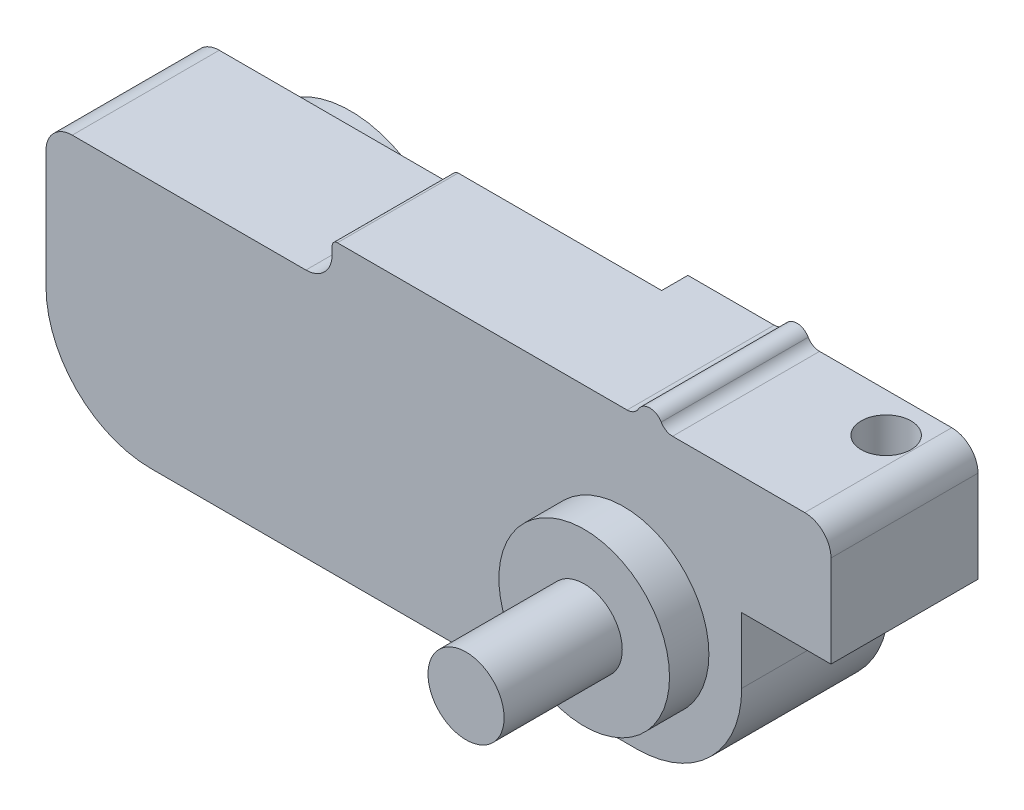
ISO-10303-21;
HEADER;
FILE_DESCRIPTION(('STEP AP214'),'2;1');
FILE_NAME('part.step','',(''),(''),'','','');
FILE_SCHEMA(('AUTOMOTIVE_DESIGN { 1 0 10303 214 1 1 1 1 }'));
ENDSEC;
DATA;
#1=APPLICATION_CONTEXT('core data for automotive mechanical design processes');
#2=APPLICATION_PROTOCOL_DEFINITION('international standard','automotive_design',2000,#1);
#3=PRODUCT_CONTEXT('',#1,'mechanical');
#4=PRODUCT('Part','Part','',(#3));
#5=PRODUCT_RELATED_PRODUCT_CATEGORY('part','',(#4));
#6=PRODUCT_DEFINITION_FORMATION('','',#4);
#7=PRODUCT_DEFINITION_CONTEXT('part definition',#1,'design');
#8=PRODUCT_DEFINITION('design','',#6,#7);
#9=PRODUCT_DEFINITION_SHAPE('','',#8);
#10=(LENGTH_UNIT() NAMED_UNIT(*) SI_UNIT(.MILLI.,.METRE.));
#11=(NAMED_UNIT(*) PLANE_ANGLE_UNIT() SI_UNIT($,.RADIAN.));
#12=(NAMED_UNIT(*) SI_UNIT($,.STERADIAN.) SOLID_ANGLE_UNIT());
#13=UNCERTAINTY_MEASURE_WITH_UNIT(LENGTH_MEASURE(1.E-05),#10,'distance_accuracy_value','');
#14=(GEOMETRIC_REPRESENTATION_CONTEXT(3) GLOBAL_UNCERTAINTY_ASSIGNED_CONTEXT((#13)) GLOBAL_UNIT_ASSIGNED_CONTEXT((#10,
#11,#12)) REPRESENTATION_CONTEXT('',''));
#15=CARTESIAN_POINT('',(0.,0.,0.));
#16=DIRECTION('',(0.,0.,1.));
#17=DIRECTION('',(1.,0.,0.));
#18=AXIS2_PLACEMENT_3D('',#15,#16,#17);
#19=CARTESIAN_POINT('',(0.,0.,0.));
#20=DIRECTION('',(0.,0.,1.));
#21=DIRECTION('',(1.,0.,0.));
#22=AXIS2_PLACEMENT_3D('',#19,#20,#21);
#23=PLANE('',#22);
#24=DIRECTION('',(1.,0.,0.));
#25=VECTOR('',#24,1.);
#26=CARTESIAN_POINT('',(37.0734009118206,-1.50250659283963,0.));
#27=LINE('',#26,#25);
#28=CARTESIAN_POINT('',(37.0734009118206,-1.50250659283963,0.));
#29=VERTEX_POINT('',#28);
#30=CARTESIAN_POINT('',(37.7443595981123,-1.50250659283966,0.));
#31=VERTEX_POINT('',#30);
#32=EDGE_CURVE('E467',#29,#31,#27,.T.);
#33=ORIENTED_EDGE('',*,*,#32,.F.);
#34=CARTESIAN_POINT('',(33.0734009118206,-1.50250659283963,0.));
#35=DIRECTION('',(0.,0.,-1.));
#36=DIRECTION('',(-1.,0.,0.));
#37=AXIS2_PLACEMENT_3D('',#34,#35,#36);
#38=CIRCLE('',#37,4.);
#39=CARTESIAN_POINT('',(29.0734009118206,-1.50250659283963,0.));
#40=VERTEX_POINT('',#39);
#41=EDGE_CURVE('E251',#40,#29,#38,.T.);
#42=ORIENTED_EDGE('',*,*,#41,.F.);
#43=DIRECTION('',(0.,-1.,0.));
#44=VECTOR('',#43,1.);
#45=CARTESIAN_POINT('',(29.0734009118206,5.49749340716037,0.));
#46=LINE('',#45,#44);
#47=CARTESIAN_POINT('',(29.0734009118206,2.99749340716037,0.));
#48=VERTEX_POINT('',#47);
#49=EDGE_CURVE('E348',#48,#40,#46,.T.);
#50=ORIENTED_EDGE('',*,*,#49,.F.);
#51=CARTESIAN_POINT('',(30.0734009118206,2.99749340716037,0.));
#52=DIRECTION('',(0.,0.,1.));
#53=DIRECTION('',(1.,0.,0.));
#54=AXIS2_PLACEMENT_3D('',#51,#52,#53);
#55=CIRCLE('',#54,1.);
#56=CARTESIAN_POINT('',(30.0734009118206,3.99749340716037,0.));
#57=VERTEX_POINT('',#56);
#58=EDGE_CURVE('E413',#48,#57,#55,.F.);
#59=ORIENTED_EDGE('',*,*,#58,.T.);
#60=DIRECTION('',(1.,0.,0.));
#61=VECTOR('',#60,1.);
#62=CARTESIAN_POINT('',(29.0734009118206,3.99749340716037,0.));
#63=LINE('',#62,#61);
#64=CARTESIAN_POINT('',(38.7234009118206,3.99749340716037,0.));
#65=VERTEX_POINT('',#64);
#66=EDGE_CURVE('E286',#57,#65,#63,.T.);
#67=ORIENTED_EDGE('',*,*,#66,.T.);
#68=DIRECTION('',(0.,1.,0.));
#69=VECTOR('',#68,1.);
#70=CARTESIAN_POINT('',(38.7234009118206,5.49749340716037,0.));
#71=LINE('',#70,#69);
#72=CARTESIAN_POINT('',(38.7234009118206,1.79749340716037,0.));
#73=VERTEX_POINT('',#72);
#74=EDGE_CURVE('E265',#73,#65,#71,.T.);
#75=ORIENTED_EDGE('',*,*,#74,.F.);
#76=DIRECTION('',(-1.,0.,0.));
#77=VECTOR('',#76,1.);
#78=CARTESIAN_POINT('',(47.9234009118206,1.79749340716037,0.));
#79=LINE('',#78,#77);
#80=CARTESIAN_POINT('',(45.9234009118206,1.79749340716037,0.));
#81=VERTEX_POINT('',#80);
#82=EDGE_CURVE('E256',#81,#73,#79,.T.);
#83=ORIENTED_EDGE('',*,*,#82,.F.);
#84=CARTESIAN_POINT('',(45.9234009118206,3.79749340716037,0.));
#85=DIRECTION('',(0.,0.,1.));
#86=DIRECTION('',(1.,0.,0.));
#87=AXIS2_PLACEMENT_3D('',#84,#85,#86);
#88=CIRCLE('',#87,2.);
#89=CARTESIAN_POINT('',(47.9234009118206,3.79749340716037,0.));
#90=VERTEX_POINT('',#89);
#91=EDGE_CURVE('E442',#81,#90,#88,.T.);
#92=ORIENTED_EDGE('',*,*,#91,.T.);
#93=DIRECTION('',(0.,-1.,0.));
#94=VECTOR('',#93,1.);
#95=CARTESIAN_POINT('',(47.9234009118206,5.49749340716037,0.));
#96=LINE('',#95,#94);
#97=CARTESIAN_POINT('',(47.9234009118206,5.49749340716037,0.));
#98=VERTEX_POINT('',#97);
#99=EDGE_CURVE('E252',#98,#90,#96,.T.);
#100=ORIENTED_EDGE('',*,*,#99,.F.);
#101=DIRECTION('',(-1.,0.,0.));
#102=VECTOR('',#101,1.);
#103=CARTESIAN_POINT('',(29.0734009118206,5.49749340716037,0.));
#104=LINE('',#103,#102);
#105=CARTESIAN_POINT('',(51.2073755080361,5.49749340716037,0.));
#106=VERTEX_POINT('',#105);
#107=EDGE_CURVE('E368',#106,#98,#104,.T.);
#108=ORIENTED_EDGE('',*,*,#107,.F.);
#109=CARTESIAN_POINT('',(51.2073755080361,5.99749340716037,0.));
#110=DIRECTION('',(0.,0.,1.));
#111=DIRECTION('',(1.,0.,0.));
#112=AXIS2_PLACEMENT_3D('',#109,#110,#111);
#113=CIRCLE('',#112,0.5);
#114=CARTESIAN_POINT('',(51.6403882099283,5.74749340716036,0.));
#115=VERTEX_POINT('',#114);
#116=EDGE_CURVE('E393',#106,#115,#113,.T.);
#117=ORIENTED_EDGE('',*,*,#116,.T.);
#118=CARTESIAN_POINT('',(52.0734009118206,5.49749340716037,0.));
#119=DIRECTION('',(0.,0.,1.));
#120=DIRECTION('',(1.,0.,0.));
#121=AXIS2_PLACEMENT_3D('',#118,#119,#120);
#122=CIRCLE('',#121,0.499999999999999);
#123=CARTESIAN_POINT('',(52.5064136137128,5.74749340716036,0.));
#124=VERTEX_POINT('',#123);
#125=EDGE_CURVE('E301',#124,#115,#122,.T.);
#126=ORIENTED_EDGE('',*,*,#125,.F.);
#127=CARTESIAN_POINT('',(52.939426315605,5.99749340716037,0.));
#128=DIRECTION('',(0.,0.,1.));
#129=DIRECTION('',(1.,0.,0.));
#130=AXIS2_PLACEMENT_3D('',#127,#128,#129);
#131=CIRCLE('',#130,0.5);
#132=CARTESIAN_POINT('',(52.939426315605,5.49749340716037,0.));
#133=VERTEX_POINT('',#132);
#134=EDGE_CURVE('E390',#124,#133,#131,.T.);
#135=ORIENTED_EDGE('',*,*,#134,.T.);
#136=CARTESIAN_POINT('',(57.9734009118206,5.49749340716037,0.));
#137=VERTEX_POINT('',#136);
#138=EDGE_CURVE('E353',#137,#133,#104,.T.);
#139=ORIENTED_EDGE('',*,*,#138,.F.);
#140=CARTESIAN_POINT('',(57.9734009118206,4.49749340716037,0.));
#141=DIRECTION('',(0.,0.,1.));
#142=DIRECTION('',(1.,0.,0.));
#143=AXIS2_PLACEMENT_3D('',#140,#141,#142);
#144=CIRCLE('',#143,1.);
#145=CARTESIAN_POINT('',(58.9734009118206,4.49749340716037,0.));
#146=VERTEX_POINT('',#145);
#147=EDGE_CURVE('E400',#137,#146,#144,.F.);
#148=ORIENTED_EDGE('',*,*,#147,.T.);
#149=DIRECTION('',(0.,1.,0.));
#150=VECTOR('',#149,1.);
#151=CARTESIAN_POINT('',(58.9734009118206,5.49749340716037,0.));
#152=LINE('',#151,#150);
#153=CARTESIAN_POINT('',(58.9734009118206,0.997493407160366,0.));
#154=VERTEX_POINT('',#153);
#155=EDGE_CURVE('E365',#154,#146,#152,.T.);
#156=ORIENTED_EDGE('',*,*,#155,.F.);
#157=DIRECTION('',(-1.,0.,0.));
#158=VECTOR('',#157,1.);
#159=CARTESIAN_POINT('',(58.9734009118206,0.997493407160366,0.));
#160=LINE('',#159,#158);
#161=CARTESIAN_POINT('',(55.5734009118206,0.997493407160366,0.));
#162=VERTEX_POINT('',#161);
#163=EDGE_CURVE('E307',#154,#162,#160,.T.);
#164=ORIENTED_EDGE('',*,*,#163,.T.);
#165=DIRECTION('',(0.,-1.,0.));
#166=VECTOR('',#165,1.);
#167=CARTESIAN_POINT('',(55.5734009118206,-5.50250659283963,0.));
#168=LINE('',#167,#166);
#169=CARTESIAN_POINT('',(55.5734009118206,-1.50250659283963,0.));
#170=VERTEX_POINT('',#169);
#171=EDGE_CURVE('E310',#162,#170,#168,.T.);
#172=ORIENTED_EDGE('',*,*,#171,.T.);
#173=CARTESIAN_POINT('',(51.5734009118206,-1.50250659283963,0.));
#174=DIRECTION('',(0.,0.,1.));
#175=DIRECTION('',(1.,0.,0.));
#176=AXIS2_PLACEMENT_3D('',#173,#174,#175);
#177=CIRCLE('',#176,4.);
#178=CARTESIAN_POINT('',(51.5734009118206,-5.50250659283963,0.));
#179=VERTEX_POINT('',#178);
#180=EDGE_CURVE('E376',#170,#179,#177,.F.);
#181=ORIENTED_EDGE('',*,*,#180,.T.);
#182=DIRECTION('',(1.,0.,0.));
#183=VECTOR('',#182,1.);
#184=CARTESIAN_POINT('',(29.0734009118206,-5.50250659283963,0.));
#185=LINE('',#184,#183);
#186=CARTESIAN_POINT('',(33.0734009118206,-5.50250659283963,0.));
#187=VERTEX_POINT('',#186);
#188=EDGE_CURVE('E362',#187,#179,#185,.T.);
#189=ORIENTED_EDGE('',*,*,#188,.F.);
#190=CARTESIAN_POINT('',(36.5375025269583,-3.50250659283963,0.));
#191=VERTEX_POINT('',#190);
#192=EDGE_CURVE('E342',#191,#187,#38,.T.);
#193=ORIENTED_EDGE('',*,*,#192,.F.);
#194=DIRECTION('',(-0.967387380482816,0.253301512199584,0.));
#195=VECTOR('',#194,1.);
#196=CARTESIAN_POINT('',(38.7443595981122,-4.08035187448123,0.));
#197=LINE('',#196,#195);
#198=CARTESIAN_POINT('',(37.4910580859126,-3.75218636944464,0.));
#199=VERTEX_POINT('',#198);
#200=EDGE_CURVE('E245',#199,#191,#197,.T.);
#201=ORIENTED_EDGE('',*,*,#200,.F.);
#202=CARTESIAN_POINT('',(37.7443595981122,-2.78479898896182,0.));
#203=DIRECTION('',(0.,0.,1.));
#204=DIRECTION('',(1.,0.,0.));
#205=AXIS2_PLACEMENT_3D('',#202,#203,#204);
#206=CIRCLE('',#205,1.);
#207=CARTESIAN_POINT('',(38.7443595981122,-2.78479898896186,0.));
#208=VERTEX_POINT('',#207);
#209=EDGE_CURVE('E48',#199,#208,#206,.T.);
#210=ORIENTED_EDGE('',*,*,#209,.T.);
#211=DIRECTION('',(0.,-1.,0.));
#212=VECTOR('',#211,1.);
#213=CARTESIAN_POINT('',(38.7443595981123,-1.50250659283969,0.));
#214=LINE('',#213,#212);
#215=CARTESIAN_POINT('',(38.7443595981122,-2.50250659283969,0.));
#216=VERTEX_POINT('',#215);
#217=EDGE_CURVE('E458',#216,#208,#214,.T.);
#218=ORIENTED_EDGE('',*,*,#217,.F.);
#219=CARTESIAN_POINT('',(37.7443595981122,-2.50250659283966,0.));
#220=DIRECTION('',(0.,0.,1.));
#221=DIRECTION('',(1.,0.,0.));
#222=AXIS2_PLACEMENT_3D('',#219,#220,#221);
#223=CIRCLE('',#222,1.);
#224=EDGE_CURVE('E11',#216,#31,#223,.T.);
#225=ORIENTED_EDGE('',*,*,#224,.T.);
#226=EDGE_LOOP('',(#33,#42,#50,#59,#67,#75,#83,#92,#100,#108,#117,#126,#135,#139,#148,#156,#164,
#172,#181,#189,#193,#201,#210,#218,#225));
#227=FACE_BOUND('',#226,.T.);
#228=ADVANCED_FACE('F40',(#227),#23,.F.);
#229=CARTESIAN_POINT('',(33.0734009118206,-1.50250659283963,-2.));
#230=DIRECTION('',(0.,0.,1.));
#231=DIRECTION('',(1.,0.,0.));
#232=AXIS2_PLACEMENT_3D('',#229,#230,#231);
#233=CYLINDRICAL_SURFACE('',#232,4.);
#234=CARTESIAN_POINT('',(33.0734009118206,-1.50250659283963,-2.));
#235=DIRECTION('',(0.,0.,-1.));
#236=DIRECTION('',(-1.,0.,0.));
#237=AXIS2_PLACEMENT_3D('',#234,#235,#236);
#238=CIRCLE('',#237,4.);
#239=CARTESIAN_POINT('',(29.0734009118206,-1.50250659283963,-2.));
#240=VERTEX_POINT('',#239);
#241=EDGE_CURVE('E345',#240,#240,#238,.T.);
#242=ORIENTED_EDGE('',*,*,#241,.F.);
#243=EDGE_LOOP('',(#242));
#244=FACE_BOUND('',#243,.T.);
#245=DIRECTION('',(0.,0.,1.));
#246=VECTOR('',#245,1.);
#247=CARTESIAN_POINT('',(37.0734009118206,-1.50250659283963,-0.4));
#248=LINE('',#247,#246);
#249=CARTESIAN_POINT('',(37.0734009118206,-1.50250659283963,-0.4));
#250=VERTEX_POINT('',#249);
#251=EDGE_CURVE('E231',#250,#29,#248,.T.);
#252=ORIENTED_EDGE('',*,*,#251,.F.);
#253=CARTESIAN_POINT('',(33.0734009118201,-1.50250659283938,-0.4));
#254=DIRECTION('',(0.,0.,1.));
#255=DIRECTION('',(-1.,0.,0.));
#256=AXIS2_PLACEMENT_3D('',#253,#254,#255);
#257=CIRCLE('',#256,4.00000000000052);
#258=CARTESIAN_POINT('',(36.5375025269583,-3.50250659283963,-0.4));
#259=VERTEX_POINT('',#258);
#260=EDGE_CURVE('E235',#259,#250,#257,.T.);
#261=ORIENTED_EDGE('',*,*,#260,.F.);
#262=DIRECTION('',(0.,0.,1.));
#263=VECTOR('',#262,1.);
#264=CARTESIAN_POINT('',(36.5375025269583,-3.50250659283963,-0.4));
#265=LINE('',#264,#263);
#266=EDGE_CURVE('E253',#259,#191,#265,.T.);
#267=ORIENTED_EDGE('',*,*,#266,.T.);
#268=ORIENTED_EDGE('',*,*,#192,.T.);
#269=DIRECTION('',(0.,0.,-1.));
#270=VECTOR('',#269,1.);
#271=CARTESIAN_POINT('',(33.0734009118206,-5.50250659283963,5.6));
#272=LINE('',#271,#270);
#273=CARTESIAN_POINT('',(33.0734009118206,-5.50250659283963,5.6));
#274=VERTEX_POINT('',#273);
#275=EDGE_CURVE('E339',#274,#187,#272,.T.);
#276=ORIENTED_EDGE('',*,*,#275,.F.);
#277=CARTESIAN_POINT('',(33.0734009118206,-1.50250659283963,5.6));
#278=DIRECTION('',(0.,0.,1.));
#279=DIRECTION('',(1.,0.,0.));
#280=AXIS2_PLACEMENT_3D('',#277,#278,#279);
#281=CIRCLE('',#280,4.00000000000001);
#282=CARTESIAN_POINT('',(29.0734009118206,-1.50250659283963,5.6));
#283=VERTEX_POINT('',#282);
#284=EDGE_CURVE('E334',#283,#274,#281,.T.);
#285=ORIENTED_EDGE('',*,*,#284,.F.);
#286=DIRECTION('',(0.,0.,-1.));
#287=VECTOR('',#286,1.);
#288=CARTESIAN_POINT('',(29.0734009118206,-1.50250659283963,5.6));
#289=LINE('',#288,#287);
#290=EDGE_CURVE('E340',#283,#40,#289,.T.);
#291=ORIENTED_EDGE('',*,*,#290,.T.);
#292=ORIENTED_EDGE('',*,*,#41,.T.);
#293=EDGE_LOOP('',(#252,#261,#267,#268,#276,#285,#291,#292));
#294=FACE_BOUND('',#293,.T.);
#295=ADVANCED_FACE('F248',(#244,#294),#233,.T.);
#296=CARTESIAN_POINT('',(39.9734009118206,5.49749340716037,0.));
#297=DIRECTION('',(1.,0.,0.));
#298=DIRECTION('',(0.,0.,-1.));
#299=AXIS2_PLACEMENT_3D('',#296,#297,#298);
#300=PLANE('',#299);
#301=DIRECTION('',(0.,1.,0.));
#302=VECTOR('',#301,1.);
#303=CARTESIAN_POINT('',(39.9734009118206,5.49749340716037,1.));
#304=LINE('',#303,#302);
#305=CARTESIAN_POINT('',(39.9734009118206,4.99749340716037,1.));
#306=VERTEX_POINT('',#305);
#307=CARTESIAN_POINT('',(39.9734009118206,5.29749340716037,1.));
#308=VERTEX_POINT('',#307);
#309=EDGE_CURVE('E277',#306,#308,#304,.T.);
#310=ORIENTED_EDGE('',*,*,#309,.F.);
#311=DIRECTION('',(0.,0.,1.));
#312=VECTOR('',#311,1.);
#313=CARTESIAN_POINT('',(39.9734009118206,4.99749340716037,5.6));
#314=LINE('',#313,#312);
#315=CARTESIAN_POINT('',(39.9734009118206,4.99749340716037,5.6));
#316=VERTEX_POINT('',#315);
#317=EDGE_CURVE('E415',#306,#316,#314,.T.);
#318=ORIENTED_EDGE('',*,*,#317,.T.);
#319=DIRECTION('',(0.,1.,0.));
#320=VECTOR('',#319,1.);
#321=CARTESIAN_POINT('',(39.9734009118206,5.49749340716037,5.6));
#322=LINE('',#321,#320);
#323=CARTESIAN_POINT('',(39.9734009118206,5.29749340716037,5.6));
#324=VERTEX_POINT('',#323);
#325=EDGE_CURVE('E290',#316,#324,#322,.T.);
#326=ORIENTED_EDGE('',*,*,#325,.T.);
#327=DIRECTION('',(0.,0.,1.));
#328=VECTOR('',#327,1.);
#329=CARTESIAN_POINT('',(39.9734009118206,5.29749340716037,0.));
#330=LINE('',#329,#328);
#331=EDGE_CURVE('E426',#324,#308,#330,.F.);
#332=ORIENTED_EDGE('',*,*,#331,.T.);
#333=EDGE_LOOP('',(#310,#318,#326,#332));
#334=FACE_BOUND('',#333,.T.);
#335=ADVANCED_FACE('F540',(#334),#300,.F.);
#336=CARTESIAN_POINT('',(38.9734009118206,4.99749340716037,0.));
#337=DIRECTION('',(0.,0.,-1.));
#338=DIRECTION('',(-1.,0.,0.));
#339=AXIS2_PLACEMENT_3D('',#336,#337,#338);
#340=CYLINDRICAL_SURFACE('',#339,1.);
#341=CARTESIAN_POINT('',(38.9734009118206,4.99749340716037,1.));
#342=DIRECTION('',(0.,0.,-1.));
#343=DIRECTION('',(-1.,0.,0.));
#344=AXIS2_PLACEMENT_3D('',#341,#342,#343);
#345=CIRCLE('',#344,1.);
#346=CARTESIAN_POINT('',(38.9734009118206,3.99749340716037,1.));
#347=VERTEX_POINT('',#346);
#348=EDGE_CURVE('E281',#347,#306,#345,.F.);
#349=ORIENTED_EDGE('',*,*,#348,.F.);
#350=DIRECTION('',(0.,0.,1.));
#351=VECTOR('',#350,1.);
#352=CARTESIAN_POINT('',(38.9734009118206,3.99749340716037,0.));
#353=LINE('',#352,#351);
#354=CARTESIAN_POINT('',(38.9734009118206,3.99749340716037,5.6));
#355=VERTEX_POINT('',#354);
#356=EDGE_CURVE('E417',#355,#347,#353,.F.);
#357=ORIENTED_EDGE('',*,*,#356,.F.);
#358=CARTESIAN_POINT('',(38.9734009118206,4.99749340716037,5.6));
#359=DIRECTION('',(0.,0.,1.));
#360=DIRECTION('',(1.,0.,0.));
#361=AXIS2_PLACEMENT_3D('',#358,#359,#360);
#362=CIRCLE('',#361,1.);
#363=EDGE_CURVE('E420',#316,#355,#362,.F.);
#364=ORIENTED_EDGE('',*,*,#363,.F.);
#365=ORIENTED_EDGE('',*,*,#317,.F.);
#366=EDGE_LOOP('',(#349,#357,#364,#365));
#367=FACE_BOUND('',#366,.T.);
#368=ADVANCED_FACE('F546',(#367),#340,.F.);
#369=CARTESIAN_POINT('',(40.1734009118206,5.29749340716037,5.6));
#370=DIRECTION('',(0.,0.,1.));
#371=DIRECTION('',(1.,0.,0.));
#372=AXIS2_PLACEMENT_3D('',#369,#370,#371);
#373=CYLINDRICAL_SURFACE('',#372,0.2);
#374=DIRECTION('',(0.,0.,1.));
#375=VECTOR('',#374,1.);
#376=CARTESIAN_POINT('',(40.1734009118206,5.49749340716037,5.6));
#377=LINE('',#376,#375);
#378=CARTESIAN_POINT('',(40.1734009118206,5.49749340716037,1.));
#379=VERTEX_POINT('',#378);
#380=CARTESIAN_POINT('',(40.1734009118206,5.49749340716037,5.6));
#381=VERTEX_POINT('',#380);
#382=EDGE_CURVE('E422',#379,#381,#377,.T.);
#383=ORIENTED_EDGE('',*,*,#382,.F.);
#384=CARTESIAN_POINT('',(40.1734009118206,5.29749340716037,1.));
#385=DIRECTION('',(0.,0.,-1.));
#386=DIRECTION('',(-1.,0.,0.));
#387=AXIS2_PLACEMENT_3D('',#384,#385,#386);
#388=CIRCLE('',#387,0.2);
#389=EDGE_CURVE('E429',#379,#308,#388,.F.);
#390=ORIENTED_EDGE('',*,*,#389,.T.);
#391=ORIENTED_EDGE('',*,*,#331,.F.);
#392=CARTESIAN_POINT('',(40.1734009118206,5.29749340716037,5.6));
#393=DIRECTION('',(0.,0.,1.));
#394=DIRECTION('',(1.,0.,0.));
#395=AXIS2_PLACEMENT_3D('',#392,#393,#394);
#396=CIRCLE('',#395,0.2);
#397=EDGE_CURVE('E424',#381,#324,#396,.T.);
#398=ORIENTED_EDGE('',*,*,#397,.F.);
#399=EDGE_LOOP('',(#383,#390,#391,#398));
#400=FACE_BOUND('',#399,.T.);
#401=ADVANCED_FACE('F536',(#400),#373,.T.);
#402=CARTESIAN_POINT('',(29.0734009118206,5.49749340716037,5.6));
#403=DIRECTION('',(0.,-1.,0.));
#404=DIRECTION('',(0.,0.,-1.));
#405=AXIS2_PLACEMENT_3D('',#402,#403,#404);
#406=PLANE('',#405);
#407=CARTESIAN_POINT('',(56.9734009118206,5.49749340716037,1.5));
#408=DIRECTION('',(0.,-1.,0.));
#409=DIRECTION('',(0.,0.,-1.));
#410=AXIS2_PLACEMENT_3D('',#407,#408,#409);
#411=CIRCLE('',#410,0.950000000000001);
#412=CARTESIAN_POINT('',(56.9734009118206,5.49749340716037,0.549999999999999));
#413=VERTEX_POINT('',#412);
#414=EDGE_CURVE('E297',#413,#413,#411,.F.);
#415=ORIENTED_EDGE('',*,*,#414,.F.);
#416=EDGE_LOOP('',(#415));
#417=FACE_BOUND('',#416,.T.);
#418=DIRECTION('',(-1.,0.,0.));
#419=VECTOR('',#418,1.);
#420=CARTESIAN_POINT('',(29.0734009118206,5.49749340716037,5.6));
#421=LINE('',#420,#419);
#422=CARTESIAN_POINT('',(57.9734009118206,5.49749340716037,5.6));
#423=VERTEX_POINT('',#422);
#424=CARTESIAN_POINT('',(52.939426315605,5.49749340716037,5.6));
#425=VERTEX_POINT('',#424);
#426=EDGE_CURVE('E330',#423,#425,#421,.T.);
#427=ORIENTED_EDGE('',*,*,#426,.F.);
#428=DIRECTION('',(0.,0.,-1.));
#429=VECTOR('',#428,1.);
#430=CARTESIAN_POINT('',(57.9734009118206,5.49749340716037,5.6));
#431=LINE('',#430,#429);
#432=EDGE_CURVE('E397',#423,#137,#431,.T.);
#433=ORIENTED_EDGE('',*,*,#432,.T.);
#434=ORIENTED_EDGE('',*,*,#138,.T.);
#435=DIRECTION('',(0.,0.,1.));
#436=VECTOR('',#435,1.);
#437=CARTESIAN_POINT('',(52.939426315605,5.49749340716037,5.6));
#438=LINE('',#437,#436);
#439=EDGE_CURVE('E378',#133,#425,#438,.T.);
#440=ORIENTED_EDGE('',*,*,#439,.T.);
#441=EDGE_LOOP('',(#427,#433,#434,#440));
#442=FACE_BOUND('',#441,.T.);
#443=ADVANCED_FACE('F509',(#417,#442),#406,.F.);
#444=CARTESIAN_POINT('',(29.0734009118206,-5.50250659283963,5.6));
#445=DIRECTION('',(0.,1.,0.));
#446=DIRECTION('',(-1.,0.,0.));
#447=AXIS2_PLACEMENT_3D('',#444,#445,#446);
#448=PLANE('',#447);
#449=ORIENTED_EDGE('',*,*,#188,.T.);
#450=DIRECTION('',(0.,0.,1.));
#451=VECTOR('',#450,1.);
#452=CARTESIAN_POINT('',(51.5734009118206,-5.50250659283963,5.6));
#453=LINE('',#452,#451);
#454=CARTESIAN_POINT('',(51.5734009118206,-5.50250659283963,5.6));
#455=VERTEX_POINT('',#454);
#456=EDGE_CURVE('E329',#179,#455,#453,.T.);
#457=ORIENTED_EDGE('',*,*,#456,.T.);
#458=DIRECTION('',(1.,0.,0.));
#459=VECTOR('',#458,1.);
#460=CARTESIAN_POINT('',(29.0734009118206,-5.50250659283963,5.6));
#461=LINE('',#460,#459);
#462=EDGE_CURVE('E352',#274,#455,#461,.T.);
#463=ORIENTED_EDGE('',*,*,#462,.F.);
#464=ORIENTED_EDGE('',*,*,#275,.T.);
#465=EDGE_LOOP('',(#449,#457,#463,#464));
#466=FACE_BOUND('',#465,.T.);
#467=ADVANCED_FACE('F480',(#466),#448,.F.);
#468=CARTESIAN_POINT('',(29.0734009118206,5.49749340716037,5.6));
#469=DIRECTION('',(1.,0.,0.));
#470=DIRECTION('',(0.,0.,-1.));
#471=AXIS2_PLACEMENT_3D('',#468,#469,#470);
#472=PLANE('',#471);
#473=DIRECTION('',(0.,-1.,0.));
#474=VECTOR('',#473,1.);
#475=CARTESIAN_POINT('',(29.0734009118206,5.49749340716037,5.6));
#476=LINE('',#475,#474);
#477=CARTESIAN_POINT('',(29.0734009118206,2.99749340716037,5.6));
#478=VERTEX_POINT('',#477);
#479=EDGE_CURVE('E350',#478,#283,#476,.T.);
#480=ORIENTED_EDGE('',*,*,#479,.F.);
#481=DIRECTION('',(0.,0.,1.));
#482=VECTOR('',#481,1.);
#483=CARTESIAN_POINT('',(29.0734009118206,2.99749340716037,5.6));
#484=LINE('',#483,#482);
#485=EDGE_CURVE('E411',#478,#48,#484,.F.);
#486=ORIENTED_EDGE('',*,*,#485,.T.);
#487=ORIENTED_EDGE('',*,*,#49,.T.);
#488=ORIENTED_EDGE('',*,*,#290,.F.);
#489=EDGE_LOOP('',(#480,#486,#487,#488));
#490=FACE_BOUND('',#489,.T.);
#491=ADVANCED_FACE('F561',(#490),#472,.F.);
#492=CARTESIAN_POINT('',(58.9734009118206,5.49749340716037,5.6));
#493=DIRECTION('',(-1.,0.,0.));
#494=DIRECTION('',(0.,0.,1.));
#495=AXIS2_PLACEMENT_3D('',#492,#493,#494);
#496=PLANE('',#495);
#497=ORIENTED_EDGE('',*,*,#155,.T.);
#498=DIRECTION('',(0.,0.,-1.));
#499=VECTOR('',#498,1.);
#500=CARTESIAN_POINT('',(58.9734009118206,4.49749340716037,5.6));
#501=LINE('',#500,#499);
#502=CARTESIAN_POINT('',(58.9734009118206,4.49749340716037,5.6));
#503=VERTEX_POINT('',#502);
#504=EDGE_CURVE('E402',#146,#503,#501,.F.);
#505=ORIENTED_EDGE('',*,*,#504,.T.);
#506=DIRECTION('',(0.,1.,0.));
#507=VECTOR('',#506,1.);
#508=CARTESIAN_POINT('',(58.9734009118206,5.49749340716037,5.6));
#509=LINE('',#508,#507);
#510=CARTESIAN_POINT('',(58.9734009118206,0.997493407160366,5.6));
#511=VERTEX_POINT('',#510);
#512=EDGE_CURVE('E356',#511,#503,#509,.T.);
#513=ORIENTED_EDGE('',*,*,#512,.F.);
#514=DIRECTION('',(0.,0.,1.));
#515=VECTOR('',#514,1.);
#516=CARTESIAN_POINT('',(58.9734009118206,0.997493407160366,0.));
#517=LINE('',#516,#515);
#518=EDGE_CURVE('E314',#154,#511,#517,.T.);
#519=ORIENTED_EDGE('',*,*,#518,.F.);
#520=EDGE_LOOP('',(#497,#505,#513,#519));
#521=FACE_BOUND('',#520,.T.);
#522=ADVANCED_FACE('F500',(#521),#496,.F.);
#523=ORIENTED_EDGE('',*,*,#107,.T.);
#524=DIRECTION('',(0.,0.,-1.));
#525=VECTOR('',#524,1.);
#526=CARTESIAN_POINT('',(47.9234009118206,5.49749340716037,1.));
#527=LINE('',#526,#525);
#528=CARTESIAN_POINT('',(47.9234009118206,5.49749340716037,1.));
#529=VERTEX_POINT('',#528);
#530=EDGE_CURVE('E275',#529,#98,#527,.T.);
#531=ORIENTED_EDGE('',*,*,#530,.F.);
#532=DIRECTION('',(1.,0.,0.));
#533=VECTOR('',#532,1.);
#534=CARTESIAN_POINT('',(47.9234009118206,5.49749340716037,1.));
#535=LINE('',#534,#533);
#536=EDGE_CURVE('E270',#379,#529,#535,.T.);
#537=ORIENTED_EDGE('',*,*,#536,.F.);
#538=ORIENTED_EDGE('',*,*,#382,.T.);
#539=CARTESIAN_POINT('',(51.2073755080361,5.49749340716037,5.6));
#540=VERTEX_POINT('',#539);
#541=EDGE_CURVE('E359',#540,#381,#421,.T.);
#542=ORIENTED_EDGE('',*,*,#541,.F.);
#543=DIRECTION('',(0.,0.,1.));
#544=VECTOR('',#543,1.);
#545=CARTESIAN_POINT('',(51.2073755080361,5.49749340716037,5.6));
#546=LINE('',#545,#544);
#547=EDGE_CURVE('E385',#540,#106,#546,.F.);
#548=ORIENTED_EDGE('',*,*,#547,.T.);
#549=EDGE_LOOP('',(#523,#531,#537,#538,#542,#548));
#550=FACE_BOUND('',#549,.T.);
#551=ADVANCED_FACE('F528',(#550),#406,.F.);
#552=CARTESIAN_POINT('',(0.,0.,5.6));
#553=DIRECTION('',(0.,0.,1.));
#554=DIRECTION('',(1.,0.,0.));
#555=AXIS2_PLACEMENT_3D('',#552,#553,#554);
#556=PLANE('',#555);
#557=ORIENTED_EDGE('',*,*,#541,.T.);
#558=ORIENTED_EDGE('',*,*,#397,.T.);
#559=ORIENTED_EDGE('',*,*,#325,.F.);
#560=ORIENTED_EDGE('',*,*,#363,.T.);
#561=DIRECTION('',(1.,0.,0.));
#562=VECTOR('',#561,1.);
#563=CARTESIAN_POINT('',(29.0734009118206,3.99749340716037,5.6));
#564=LINE('',#563,#562);
#565=CARTESIAN_POINT('',(30.0734009118206,3.99749340716037,5.6));
#566=VERTEX_POINT('',#565);
#567=EDGE_CURVE('E285',#566,#355,#564,.T.);
#568=ORIENTED_EDGE('',*,*,#567,.F.);
#569=CARTESIAN_POINT('',(30.0734009118206,2.99749340716037,5.6));
#570=DIRECTION('',(0.,0.,1.));
#571=DIRECTION('',(1.,0.,0.));
#572=AXIS2_PLACEMENT_3D('',#569,#570,#571);
#573=CIRCLE('',#572,1.);
#574=EDGE_CURVE('E409',#566,#478,#573,.T.);
#575=ORIENTED_EDGE('',*,*,#574,.T.);
#576=ORIENTED_EDGE('',*,*,#479,.T.);
#577=ORIENTED_EDGE('',*,*,#284,.T.);
#578=ORIENTED_EDGE('',*,*,#462,.T.);
#579=CARTESIAN_POINT('',(51.5734009118206,-1.50250659283963,5.6));
#580=DIRECTION('',(0.,0.,1.));
#581=DIRECTION('',(1.,0.,0.));
#582=AXIS2_PLACEMENT_3D('',#579,#580,#581);
#583=CIRCLE('',#582,4.);
#584=CARTESIAN_POINT('',(55.5734009118206,-1.50250659283963,5.6));
#585=VERTEX_POINT('',#584);
#586=EDGE_CURVE('E372',#455,#585,#583,.T.);
#587=ORIENTED_EDGE('',*,*,#586,.T.);
#588=DIRECTION('',(0.,-1.,0.));
#589=VECTOR('',#588,1.);
#590=CARTESIAN_POINT('',(55.5734009118206,-5.50250659283963,5.6));
#591=LINE('',#590,#589);
#592=CARTESIAN_POINT('',(55.5734009118206,0.997493407160366,5.6));
#593=VERTEX_POINT('',#592);
#594=EDGE_CURVE('E311',#593,#585,#591,.T.);
#595=ORIENTED_EDGE('',*,*,#594,.F.);
#596=DIRECTION('',(-1.,0.,0.));
#597=VECTOR('',#596,1.);
#598=CARTESIAN_POINT('',(58.9734009118206,0.997493407160366,5.6));
#599=LINE('',#598,#597);
#600=EDGE_CURVE('E304',#511,#593,#599,.T.);
#601=ORIENTED_EDGE('',*,*,#600,.F.);
#602=ORIENTED_EDGE('',*,*,#512,.T.);
#603=CARTESIAN_POINT('',(57.9734009118206,4.49749340716037,5.6));
#604=DIRECTION('',(0.,0.,1.));
#605=DIRECTION('',(1.,0.,0.));
#606=AXIS2_PLACEMENT_3D('',#603,#604,#605);
#607=CIRCLE('',#606,1.);
#608=EDGE_CURVE('E404',#503,#423,#607,.T.);
#609=ORIENTED_EDGE('',*,*,#608,.T.);
#610=ORIENTED_EDGE('',*,*,#426,.T.);
#611=CARTESIAN_POINT('',(52.939426315605,5.99749340716037,5.6));
#612=DIRECTION('',(0.,0.,1.));
#613=DIRECTION('',(1.,0.,0.));
#614=AXIS2_PLACEMENT_3D('',#611,#612,#613);
#615=CIRCLE('',#614,0.5);
#616=CARTESIAN_POINT('',(52.5064136137128,5.74749340716036,5.6));
#617=VERTEX_POINT('',#616);
#618=EDGE_CURVE('E388',#425,#617,#615,.F.);
#619=ORIENTED_EDGE('',*,*,#618,.T.);
#620=CARTESIAN_POINT('',(52.0734009118206,5.49749340716037,5.6));
#621=DIRECTION('',(0.,0.,1.));
#622=DIRECTION('',(1.,0.,0.));
#623=AXIS2_PLACEMENT_3D('',#620,#621,#622);
#624=CIRCLE('',#623,0.499999999999999);
#625=CARTESIAN_POINT('',(51.6403882099283,5.74749340716036,5.6));
#626=VERTEX_POINT('',#625);
#627=EDGE_CURVE('E300',#617,#626,#624,.T.);
#628=ORIENTED_EDGE('',*,*,#627,.T.);
#629=CARTESIAN_POINT('',(51.2073755080361,5.99749340716037,5.6));
#630=DIRECTION('',(0.,0.,1.));
#631=DIRECTION('',(1.,0.,0.));
#632=AXIS2_PLACEMENT_3D('',#629,#630,#631);
#633=CIRCLE('',#632,0.5);
#634=EDGE_CURVE('E395',#626,#540,#633,.F.);
#635=ORIENTED_EDGE('',*,*,#634,.T.);
#636=EDGE_LOOP('',(#557,#558,#559,#560,#568,#575,#576,#577,#578,#587,#595,#601,#602,#609,#610,
#619,#628,#635));
#637=FACE_BOUND('',#636,.T.);
#638=CARTESIAN_POINT('',(51.0734009118206,-1.00250659283963,5.6));
#639=DIRECTION('',(0.,0.,1.));
#640=DIRECTION('',(1.,0.,0.));
#641=AXIS2_PLACEMENT_3D('',#638,#639,#640);
#642=CIRCLE('',#641,3.25);
#643=CARTESIAN_POINT('',(54.3234009118206,-1.00250659283963,5.6));
#644=VERTEX_POINT('',#643);
#645=EDGE_CURVE('E325',#644,#644,#642,.T.);
#646=ORIENTED_EDGE('',*,*,#645,.F.);
#647=EDGE_LOOP('',(#646));
#648=FACE_BOUND('',#647,.T.);
#649=ADVANCED_FACE('F488',(#637,#648),#556,.T.);
#650=CARTESIAN_POINT('',(33.0734009118206,-1.50250659283963,-2.));
#651=DIRECTION('',(0.,0.,-1.));
#652=DIRECTION('',(-1.,0.,0.));
#653=AXIS2_PLACEMENT_3D('',#650,#651,#652);
#654=PLANE('',#653);
#655=ORIENTED_EDGE('',*,*,#241,.T.);
#656=EDGE_LOOP('',(#655));
#657=FACE_BOUND('',#656,.T.);
#658=ADVANCED_FACE('F664',(#657),#654,.T.);
#659=CARTESIAN_POINT('',(51.0734009118206,-1.00250659283963,7.1));
#660=DIRECTION('',(0.,0.,-1.));
#661=DIRECTION('',(-1.,0.,0.));
#662=AXIS2_PLACEMENT_3D('',#659,#660,#661);
#663=CYLINDRICAL_SURFACE('',#662,3.25);
#664=CARTESIAN_POINT('',(51.0734009118206,-1.00250659283963,7.1));
#665=DIRECTION('',(0.,0.,1.));
#666=DIRECTION('',(1.,0.,0.));
#667=AXIS2_PLACEMENT_3D('',#664,#665,#666);
#668=CIRCLE('',#667,3.25);
#669=CARTESIAN_POINT('',(54.3234009118206,-1.00250659283963,7.1));
#670=VERTEX_POINT('',#669);
#671=EDGE_CURVE('E331',#670,#670,#668,.T.);
#672=ORIENTED_EDGE('',*,*,#671,.F.);
#673=EDGE_LOOP('',(#672));
#674=FACE_BOUND('',#673,.T.);
#675=ORIENTED_EDGE('',*,*,#645,.T.);
#676=EDGE_LOOP('',(#675));
#677=FACE_BOUND('',#676,.T.);
#678=ADVANCED_FACE('F660',(#674,#677),#663,.T.);
#679=CARTESIAN_POINT('',(51.0734009118206,-1.00250659283963,7.1));
#680=DIRECTION('',(0.,0.,1.));
#681=DIRECTION('',(1.,0.,0.));
#682=AXIS2_PLACEMENT_3D('',#679,#680,#681);
#683=PLANE('',#682);
#684=CARTESIAN_POINT('',(51.0734009118206,-1.00250659283963,7.1));
#685=DIRECTION('',(0.,0.,1.));
#686=DIRECTION('',(1.,0.,0.));
#687=AXIS2_PLACEMENT_3D('',#684,#685,#686);
#688=CIRCLE('',#687,1.45);
#689=CARTESIAN_POINT('',(52.5234009118206,-1.00250659283963,7.1));
#690=VERTEX_POINT('',#689);
#691=EDGE_CURVE('E326',#690,#690,#688,.T.);
#692=ORIENTED_EDGE('',*,*,#691,.F.);
#693=EDGE_LOOP('',(#692));
#694=FACE_BOUND('',#693,.T.);
#695=ORIENTED_EDGE('',*,*,#671,.T.);
#696=EDGE_LOOP('',(#695));
#697=FACE_BOUND('',#696,.T.);
#698=ADVANCED_FACE('F656',(#694,#697),#683,.T.);
#699=CARTESIAN_POINT('',(51.0734009118206,-1.00250659283963,11.6));
#700=DIRECTION('',(0.,0.,-1.));
#701=DIRECTION('',(-1.,0.,0.));
#702=AXIS2_PLACEMENT_3D('',#699,#700,#701);
#703=CYLINDRICAL_SURFACE('',#702,1.45);
#704=CARTESIAN_POINT('',(51.0734009118206,-1.00250659283963,11.6));
#705=DIRECTION('',(0.,0.,1.));
#706=DIRECTION('',(1.,0.,0.));
#707=AXIS2_PLACEMENT_3D('',#704,#705,#706);
#708=CIRCLE('',#707,1.45);
#709=CARTESIAN_POINT('',(52.5234009118206,-1.00250659283963,11.6));
#710=VERTEX_POINT('',#709);
#711=EDGE_CURVE('E321',#710,#710,#708,.T.);
#712=ORIENTED_EDGE('',*,*,#711,.F.);
#713=EDGE_LOOP('',(#712));
#714=FACE_BOUND('',#713,.T.);
#715=ORIENTED_EDGE('',*,*,#691,.T.);
#716=EDGE_LOOP('',(#715));
#717=FACE_BOUND('',#716,.T.);
#718=ADVANCED_FACE('F652',(#714,#717),#703,.T.);
#719=CARTESIAN_POINT('',(51.0734009118206,-1.00250659283963,11.6));
#720=DIRECTION('',(0.,0.,1.));
#721=DIRECTION('',(1.,0.,0.));
#722=AXIS2_PLACEMENT_3D('',#719,#720,#721);
#723=PLANE('',#722);
#724=ORIENTED_EDGE('',*,*,#711,.T.);
#725=EDGE_LOOP('',(#724));
#726=FACE_BOUND('',#725,.T.);
#727=ADVANCED_FACE('F646',(#726),#723,.T.);
#728=CARTESIAN_POINT('',(55.5734009118206,-5.50250659283963,0.));
#729=DIRECTION('',(-1.,0.,0.));
#730=DIRECTION('',(0.,0.,1.));
#731=AXIS2_PLACEMENT_3D('',#728,#729,#730);
#732=PLANE('',#731);
#733=ORIENTED_EDGE('',*,*,#594,.T.);
#734=DIRECTION('',(0.,0.,1.));
#735=VECTOR('',#734,1.);
#736=CARTESIAN_POINT('',(55.5734009118206,-1.50250659283963,0.));
#737=LINE('',#736,#735);
#738=EDGE_CURVE('E374',#585,#170,#737,.F.);
#739=ORIENTED_EDGE('',*,*,#738,.T.);
#740=ORIENTED_EDGE('',*,*,#171,.F.);
#741=DIRECTION('',(0.,0.,1.));
#742=VECTOR('',#741,1.);
#743=CARTESIAN_POINT('',(55.5734009118206,0.997493407160366,0.));
#744=LINE('',#743,#742);
#745=EDGE_CURVE('E319',#162,#593,#744,.T.);
#746=ORIENTED_EDGE('',*,*,#745,.T.);
#747=EDGE_LOOP('',(#733,#739,#740,#746));
#748=FACE_BOUND('',#747,.T.);
#749=ADVANCED_FACE('F492',(#748),#732,.F.);
#750=CARTESIAN_POINT('',(58.9734009118206,0.997493407160366,0.));
#751=DIRECTION('',(0.,1.,0.));
#752=DIRECTION('',(-1.,0.,0.));
#753=AXIS2_PLACEMENT_3D('',#750,#751,#752);
#754=PLANE('',#753);
#755=CARTESIAN_POINT('',(56.9734009118206,0.997493407160366,1.5));
#756=DIRECTION('',(0.,-1.,0.));
#757=DIRECTION('',(1.,0.,0.));
#758=AXIS2_PLACEMENT_3D('',#755,#756,#757);
#759=CIRCLE('',#758,0.950000000000001);
#760=CARTESIAN_POINT('',(57.9234009118206,0.997493407160366,1.5));
#761=VERTEX_POINT('',#760);
#762=EDGE_CURVE('E289',#761,#761,#759,.T.);
#763=ORIENTED_EDGE('',*,*,#762,.F.);
#764=EDGE_LOOP('',(#763));
#765=FACE_BOUND('',#764,.T.);
#766=ORIENTED_EDGE('',*,*,#600,.T.);
#767=ORIENTED_EDGE('',*,*,#745,.F.);
#768=ORIENTED_EDGE('',*,*,#163,.F.);
#769=ORIENTED_EDGE('',*,*,#518,.T.);
#770=EDGE_LOOP('',(#766,#767,#768,#769));
#771=FACE_BOUND('',#770,.T.);
#772=ADVANCED_FACE('F495',(#765,#771),#754,.F.);
#773=CARTESIAN_POINT('',(51.5734009118206,-1.50250659283963,5.6));
#774=DIRECTION('',(0.,0.,1.));
#775=DIRECTION('',(1.,0.,0.));
#776=AXIS2_PLACEMENT_3D('',#773,#774,#775);
#777=CYLINDRICAL_SURFACE('',#776,4.);
#778=ORIENTED_EDGE('',*,*,#180,.F.);
#779=ORIENTED_EDGE('',*,*,#738,.F.);
#780=ORIENTED_EDGE('',*,*,#586,.F.);
#781=ORIENTED_EDGE('',*,*,#456,.F.);
#782=EDGE_LOOP('',(#778,#779,#780,#781));
#783=FACE_BOUND('',#782,.T.);
#784=ADVANCED_FACE('F483',(#783),#777,.T.);
#785=CARTESIAN_POINT('',(52.0734009118206,5.49749340716037,0.));
#786=DIRECTION('',(0.,0.,1.));
#787=DIRECTION('',(1.,0.,0.));
#788=AXIS2_PLACEMENT_3D('',#785,#786,#787);
#789=CYLINDRICAL_SURFACE('',#788,0.499999999999999);
#790=ORIENTED_EDGE('',*,*,#627,.F.);
#791=DIRECTION('',(0.,0.,1.));
#792=VECTOR('',#791,1.);
#793=CARTESIAN_POINT('',(52.5064136137128,5.74749340716036,0.));
#794=LINE('',#793,#792);
#795=EDGE_CURVE('E383',#617,#124,#794,.F.);
#796=ORIENTED_EDGE('',*,*,#795,.T.);
#797=ORIENTED_EDGE('',*,*,#125,.T.);
#798=DIRECTION('',(0.,0.,1.));
#799=VECTOR('',#798,1.);
#800=CARTESIAN_POINT('',(51.6403882099283,5.74749340716036,0.));
#801=LINE('',#800,#799);
#802=EDGE_CURVE('E381',#115,#626,#801,.T.);
#803=ORIENTED_EDGE('',*,*,#802,.T.);
#804=EDGE_LOOP('',(#790,#796,#797,#803));
#805=FACE_BOUND('',#804,.T.);
#806=ADVANCED_FACE('F519',(#805),#789,.T.);
#807=CARTESIAN_POINT('',(52.939426315605,5.99749340716037,0.));
#808=DIRECTION('',(0.,0.,1.));
#809=DIRECTION('',(1.,0.,0.));
#810=AXIS2_PLACEMENT_3D('',#807,#808,#809);
#811=CYLINDRICAL_SURFACE('',#810,0.5);
#812=ORIENTED_EDGE('',*,*,#134,.F.);
#813=ORIENTED_EDGE('',*,*,#795,.F.);
#814=ORIENTED_EDGE('',*,*,#618,.F.);
#815=ORIENTED_EDGE('',*,*,#439,.F.);
#816=EDGE_LOOP('',(#812,#813,#814,#815));
#817=FACE_BOUND('',#816,.T.);
#818=ADVANCED_FACE('F514',(#817),#811,.F.);
#819=CARTESIAN_POINT('',(51.2073755080361,5.99749340716037,0.));
#820=DIRECTION('',(0.,0.,1.));
#821=DIRECTION('',(1.,0.,0.));
#822=AXIS2_PLACEMENT_3D('',#819,#820,#821);
#823=CYLINDRICAL_SURFACE('',#822,0.5);
#824=ORIENTED_EDGE('',*,*,#634,.F.);
#825=ORIENTED_EDGE('',*,*,#802,.F.);
#826=ORIENTED_EDGE('',*,*,#116,.F.);
#827=ORIENTED_EDGE('',*,*,#547,.F.);
#828=EDGE_LOOP('',(#824,#825,#826,#827));
#829=FACE_BOUND('',#828,.T.);
#830=ADVANCED_FACE('F523',(#829),#823,.F.);
#831=CARTESIAN_POINT('',(56.9734009118206,8.18449917566925,1.5));
#832=DIRECTION('',(0.,-1.,0.));
#833=DIRECTION('',(1.,0.,0.));
#834=AXIS2_PLACEMENT_3D('',#831,#832,#833);
#835=CYLINDRICAL_SURFACE('',#834,0.950000000000001);
#836=ORIENTED_EDGE('',*,*,#414,.T.);
#837=EDGE_LOOP('',(#836));
#838=FACE_BOUND('',#837,.T.);
#839=ORIENTED_EDGE('',*,*,#762,.T.);
#840=EDGE_LOOP('',(#839));
#841=FACE_BOUND('',#840,.T.);
#842=ADVANCED_FACE('F591',(#838,#841),#835,.F.);
#843=CARTESIAN_POINT('',(57.9734009118206,4.49749340716037,5.6));
#844=DIRECTION('',(0.,0.,-1.));
#845=DIRECTION('',(-1.,0.,0.));
#846=AXIS2_PLACEMENT_3D('',#843,#844,#845);
#847=CYLINDRICAL_SURFACE('',#846,1.);
#848=ORIENTED_EDGE('',*,*,#608,.F.);
#849=ORIENTED_EDGE('',*,*,#504,.F.);
#850=ORIENTED_EDGE('',*,*,#147,.F.);
#851=ORIENTED_EDGE('',*,*,#432,.F.);
#852=EDGE_LOOP('',(#848,#849,#850,#851));
#853=FACE_BOUND('',#852,.T.);
#854=ADVANCED_FACE('F504',(#853),#847,.T.);
#855=CARTESIAN_POINT('',(29.0734009118206,3.99749340716037,0.));
#856=DIRECTION('',(0.,-1.,0.));
#857=DIRECTION('',(0.,0.,-1.));
#858=AXIS2_PLACEMENT_3D('',#855,#856,#857);
#859=PLANE('',#858);
#860=DIRECTION('',(1.,0.,0.));
#861=VECTOR('',#860,1.);
#862=CARTESIAN_POINT('',(29.0734009118206,3.99749340716037,1.));
#863=LINE('',#862,#861);
#864=CARTESIAN_POINT('',(38.7234009118206,3.99749340716037,1.));
#865=VERTEX_POINT('',#864);
#866=EDGE_CURVE('E283',#865,#347,#863,.T.);
#867=ORIENTED_EDGE('',*,*,#866,.F.);
#868=DIRECTION('',(0.,0.,-1.));
#869=VECTOR('',#868,1.);
#870=CARTESIAN_POINT('',(38.7234009118206,3.99749340716037,0.));
#871=LINE('',#870,#869);
#872=EDGE_CURVE('E432',#865,#65,#871,.T.);
#873=ORIENTED_EDGE('',*,*,#872,.T.);
#874=ORIENTED_EDGE('',*,*,#66,.F.);
#875=DIRECTION('',(0.,0.,1.));
#876=VECTOR('',#875,1.);
#877=CARTESIAN_POINT('',(30.0734009118206,3.99749340716037,0.));
#878=LINE('',#877,#876);
#879=EDGE_CURVE('E406',#57,#566,#878,.T.);
#880=ORIENTED_EDGE('',*,*,#879,.T.);
#881=ORIENTED_EDGE('',*,*,#567,.T.);
#882=ORIENTED_EDGE('',*,*,#356,.T.);
#883=EDGE_LOOP('',(#867,#873,#874,#880,#881,#882));
#884=FACE_BOUND('',#883,.T.);
#885=ADVANCED_FACE('F550',(#884),#859,.F.);
#886=CARTESIAN_POINT('',(30.0734009118206,2.99749340716037,0.));
#887=DIRECTION('',(0.,0.,1.));
#888=DIRECTION('',(1.,0.,0.));
#889=AXIS2_PLACEMENT_3D('',#886,#887,#888);
#890=CYLINDRICAL_SURFACE('',#889,1.);
#891=ORIENTED_EDGE('',*,*,#58,.F.);
#892=ORIENTED_EDGE('',*,*,#485,.F.);
#893=ORIENTED_EDGE('',*,*,#574,.F.);
#894=ORIENTED_EDGE('',*,*,#879,.F.);
#895=EDGE_LOOP('',(#891,#892,#893,#894));
#896=FACE_BOUND('',#895,.T.);
#897=ADVANCED_FACE('F555',(#896),#890,.T.);
#898=CARTESIAN_POINT('',(38.7234009118206,5.49749340716037,1.));
#899=DIRECTION('',(-1.,0.,0.));
#900=DIRECTION('',(0.,0.,1.));
#901=AXIS2_PLACEMENT_3D('',#898,#899,#900);
#902=PLANE('',#901);
#903=DIRECTION('',(0.,1.,0.));
#904=VECTOR('',#903,1.);
#905=CARTESIAN_POINT('',(38.7234009118206,5.49749340716037,1.));
#906=LINE('',#905,#904);
#907=CARTESIAN_POINT('',(38.7234009118206,1.79749340716037,1.));
#908=VERTEX_POINT('',#907);
#909=EDGE_CURVE('E267',#908,#865,#906,.T.);
#910=ORIENTED_EDGE('',*,*,#909,.F.);
#911=DIRECTION('',(0.,0.,-1.));
#912=VECTOR('',#911,1.);
#913=CARTESIAN_POINT('',(38.7234009118206,1.79749340716037,1.));
#914=LINE('',#913,#912);
#915=EDGE_CURVE('E271',#908,#73,#914,.T.);
#916=ORIENTED_EDGE('',*,*,#915,.T.);
#917=ORIENTED_EDGE('',*,*,#74,.T.);
#918=ORIENTED_EDGE('',*,*,#872,.F.);
#919=EDGE_LOOP('',(#910,#916,#917,#918));
#920=FACE_BOUND('',#919,.T.);
#921=ADVANCED_FACE('F596',(#920),#902,.F.);
#922=CARTESIAN_POINT('',(0.,0.,1.));
#923=DIRECTION('',(0.,0.,-1.));
#924=DIRECTION('',(-1.,0.,0.));
#925=AXIS2_PLACEMENT_3D('',#922,#923,#924);
#926=PLANE('',#925);
#927=DIRECTION('',(0.,-1.,0.));
#928=VECTOR('',#927,1.);
#929=CARTESIAN_POINT('',(47.9234009118206,5.49749340716037,1.));
#930=LINE('',#929,#928);
#931=CARTESIAN_POINT('',(47.9234009118206,3.79749340716037,1.));
#932=VERTEX_POINT('',#931);
#933=EDGE_CURVE('E261',#529,#932,#930,.T.);
#934=ORIENTED_EDGE('',*,*,#933,.T.);
#935=CARTESIAN_POINT('',(45.9234009118206,3.79749340716037,1.));
#936=DIRECTION('',(0.,0.,-1.));
#937=DIRECTION('',(-1.,0.,0.));
#938=AXIS2_PLACEMENT_3D('',#935,#936,#937);
#939=CIRCLE('',#938,2.);
#940=CARTESIAN_POINT('',(45.9234009118206,1.79749340716037,1.));
#941=VERTEX_POINT('',#940);
#942=EDGE_CURVE('E440',#932,#941,#939,.T.);
#943=ORIENTED_EDGE('',*,*,#942,.T.);
#944=DIRECTION('',(-1.,0.,0.));
#945=VECTOR('',#944,1.);
#946=CARTESIAN_POINT('',(47.9234009118206,1.79749340716037,1.));
#947=LINE('',#946,#945);
#948=EDGE_CURVE('E264',#941,#908,#947,.T.);
#949=ORIENTED_EDGE('',*,*,#948,.T.);
#950=ORIENTED_EDGE('',*,*,#909,.T.);
#951=ORIENTED_EDGE('',*,*,#866,.T.);
#952=ORIENTED_EDGE('',*,*,#348,.T.);
#953=ORIENTED_EDGE('',*,*,#309,.T.);
#954=ORIENTED_EDGE('',*,*,#389,.F.);
#955=ORIENTED_EDGE('',*,*,#536,.T.);
#956=EDGE_LOOP('',(#934,#943,#949,#950,#951,#952,#953,#954,#955));
#957=FACE_BOUND('',#956,.T.);
#958=ADVANCED_FACE('F618',(#957),#926,.T.);
#959=CARTESIAN_POINT('',(47.9234009118206,5.49749340716037,1.));
#960=DIRECTION('',(1.,0.,0.));
#961=DIRECTION('',(0.,0.,-1.));
#962=AXIS2_PLACEMENT_3D('',#959,#960,#961);
#963=PLANE('',#962);
#964=ORIENTED_EDGE('',*,*,#99,.T.);
#965=DIRECTION('',(0.,0.,-1.));
#966=VECTOR('',#965,1.);
#967=CARTESIAN_POINT('',(47.9234009118206,3.79749340716037,1.));
#968=LINE('',#967,#966);
#969=EDGE_CURVE('E438',#90,#932,#968,.F.);
#970=ORIENTED_EDGE('',*,*,#969,.T.);
#971=ORIENTED_EDGE('',*,*,#933,.F.);
#972=ORIENTED_EDGE('',*,*,#530,.T.);
#973=EDGE_LOOP('',(#964,#970,#971,#972));
#974=FACE_BOUND('',#973,.T.);
#975=ADVANCED_FACE('F610',(#974),#963,.F.);
#976=CARTESIAN_POINT('',(47.9234009118206,1.79749340716037,1.));
#977=DIRECTION('',(0.,-1.,0.));
#978=DIRECTION('',(0.,0.,-1.));
#979=AXIS2_PLACEMENT_3D('',#976,#977,#978);
#980=PLANE('',#979);
#981=ORIENTED_EDGE('',*,*,#948,.F.);
#982=DIRECTION('',(0.,0.,-1.));
#983=VECTOR('',#982,1.);
#984=CARTESIAN_POINT('',(45.9234009118206,1.79749340716037,0.));
#985=LINE('',#984,#983);
#986=EDGE_CURVE('E435',#941,#81,#985,.T.);
#987=ORIENTED_EDGE('',*,*,#986,.T.);
#988=ORIENTED_EDGE('',*,*,#82,.T.);
#989=ORIENTED_EDGE('',*,*,#915,.F.);
#990=EDGE_LOOP('',(#981,#987,#988,#989));
#991=FACE_BOUND('',#990,.T.);
#992=ADVANCED_FACE('F603',(#991),#980,.F.);
#993=CARTESIAN_POINT('',(45.9234009118206,3.79749340716037,1.));
#994=DIRECTION('',(0.,0.,1.));
#995=DIRECTION('',(1.,0.,0.));
#996=AXIS2_PLACEMENT_3D('',#993,#994,#995);
#997=CYLINDRICAL_SURFACE('',#996,2.);
#998=ORIENTED_EDGE('',*,*,#942,.F.);
#999=ORIENTED_EDGE('',*,*,#969,.F.);
#1000=ORIENTED_EDGE('',*,*,#91,.F.);
#1001=ORIENTED_EDGE('',*,*,#986,.F.);
#1002=EDGE_LOOP('',(#998,#999,#1000,#1001));
#1003=FACE_BOUND('',#1002,.T.);
#1004=ADVANCED_FACE('F601',(#1003),#997,.F.);
#1005=CARTESIAN_POINT('',(37.0734009118206,-1.50250659283963,-0.4));
#1006=DIRECTION('',(0.,-1.,0.));
#1007=DIRECTION('',(1.,0.,0.));
#1008=AXIS2_PLACEMENT_3D('',#1005,#1006,#1007);
#1009=PLANE('',#1008);
#1010=ORIENTED_EDGE('',*,*,#32,.T.);
#1011=DIRECTION('',(0.,0.,1.));
#1012=VECTOR('',#1011,1.);
#1013=CARTESIAN_POINT('',(37.7443595981123,-1.50250659283966,-0.4));
#1014=LINE('',#1013,#1012);
#1015=CARTESIAN_POINT('',(37.7443595981123,-1.50250659283966,-0.4));
#1016=VERTEX_POINT('',#1015);
#1017=EDGE_CURVE('E60',#31,#1016,#1014,.F.);
#1018=ORIENTED_EDGE('',*,*,#1017,.T.);
#1019=DIRECTION('',(1.,0.,0.));
#1020=VECTOR('',#1019,1.);
#1021=CARTESIAN_POINT('',(37.0734009118206,-1.50250659283963,-0.4));
#1022=LINE('',#1021,#1020);
#1023=EDGE_CURVE('E227',#250,#1016,#1022,.T.);
#1024=ORIENTED_EDGE('',*,*,#1023,.F.);
#1025=ORIENTED_EDGE('',*,*,#251,.T.);
#1026=EDGE_LOOP('',(#1010,#1018,#1024,#1025));
#1027=FACE_BOUND('',#1026,.T.);
#1028=ADVANCED_FACE('F229',(#1027),#1009,.F.);
#1029=CARTESIAN_POINT('',(38.7443595981123,-1.50250659283969,-0.4));
#1030=DIRECTION('',(-1.,0.,0.));
#1031=DIRECTION('',(0.,-1.,0.));
#1032=AXIS2_PLACEMENT_3D('',#1029,#1030,#1031);
#1033=PLANE('',#1032);
#1034=ORIENTED_EDGE('',*,*,#217,.T.);
#1035=DIRECTION('',(0.,0.,1.));
#1036=VECTOR('',#1035,1.);
#1037=CARTESIAN_POINT('',(38.7443595981122,-2.78479898896186,-0.4));
#1038=LINE('',#1037,#1036);
#1039=CARTESIAN_POINT('',(38.7443595981122,-2.78479898896186,-0.4));
#1040=VERTEX_POINT('',#1039);
#1041=EDGE_CURVE('E450',#208,#1040,#1038,.F.);
#1042=ORIENTED_EDGE('',*,*,#1041,.T.);
#1043=DIRECTION('',(0.,-1.,0.));
#1044=VECTOR('',#1043,1.);
#1045=CARTESIAN_POINT('',(38.7443595981123,-1.50250659283969,-0.4));
#1046=LINE('',#1045,#1044);
#1047=CARTESIAN_POINT('',(38.7443595981122,-2.50250659283969,-0.4));
#1048=VERTEX_POINT('',#1047);
#1049=EDGE_CURVE('E234',#1048,#1040,#1046,.T.);
#1050=ORIENTED_EDGE('',*,*,#1049,.F.);
#1051=DIRECTION('',(0.,0.,1.));
#1052=VECTOR('',#1051,1.);
#1053=CARTESIAN_POINT('',(38.7443595981122,-2.50250659283969,-0.4));
#1054=LINE('',#1053,#1052);
#1055=EDGE_CURVE('E447',#1048,#216,#1054,.T.);
#1056=ORIENTED_EDGE('',*,*,#1055,.T.);
#1057=EDGE_LOOP('',(#1034,#1042,#1050,#1056));
#1058=FACE_BOUND('',#1057,.T.);
#1059=ADVANCED_FACE('F464',(#1058),#1033,.F.);
#1060=CARTESIAN_POINT('',(38.7443595981122,-4.08035187448123,-0.4));
#1061=DIRECTION('',(0.253301512199584,0.967387380482816,0.));
#1062=DIRECTION('',(-0.967387380482816,0.253301512199584,0.));
#1063=AXIS2_PLACEMENT_3D('',#1060,#1061,#1062);
#1064=PLANE('',#1063);
#1065=DIRECTION('',(-0.967387380482816,0.253301512199584,0.));
#1066=VECTOR('',#1065,1.);
#1067=CARTESIAN_POINT('',(38.7443595981122,-4.08035187448123,-0.4));
#1068=LINE('',#1067,#1066);
#1069=CARTESIAN_POINT('',(37.4910580859126,-3.75218636944464,-0.4));
#1070=VERTEX_POINT('',#1069);
#1071=EDGE_CURVE('E241',#1070,#259,#1068,.T.);
#1072=ORIENTED_EDGE('',*,*,#1071,.F.);
#1073=DIRECTION('',(0.,0.,1.));
#1074=VECTOR('',#1073,1.);
#1075=CARTESIAN_POINT('',(37.4910580859126,-3.75218636944464,-0.4));
#1076=LINE('',#1075,#1074);
#1077=EDGE_CURVE('E444',#1070,#199,#1076,.T.);
#1078=ORIENTED_EDGE('',*,*,#1077,.T.);
#1079=ORIENTED_EDGE('',*,*,#200,.T.);
#1080=ORIENTED_EDGE('',*,*,#266,.F.);
#1081=EDGE_LOOP('',(#1072,#1078,#1079,#1080));
#1082=FACE_BOUND('',#1081,.T.);
#1083=ADVANCED_FACE('F472',(#1082),#1064,.F.);
#1084=CARTESIAN_POINT('',(33.0734009118201,-1.50250659283938,-0.4));
#1085=DIRECTION('',(0.,0.,-1.));
#1086=DIRECTION('',(-1.,0.,0.));
#1087=AXIS2_PLACEMENT_3D('',#1084,#1085,#1086);
#1088=PLANE('',#1087);
#1089=ORIENTED_EDGE('',*,*,#1049,.T.);
#1090=CARTESIAN_POINT('',(37.7443595981122,-2.78479898896182,-0.4));
#1091=DIRECTION('',(0.,0.,-1.));
#1092=DIRECTION('',(-1.,0.,0.));
#1093=AXIS2_PLACEMENT_3D('',#1090,#1091,#1092);
#1094=CIRCLE('',#1093,1.);
#1095=EDGE_CURVE('E454',#1040,#1070,#1094,.T.);
#1096=ORIENTED_EDGE('',*,*,#1095,.T.);
#1097=ORIENTED_EDGE('',*,*,#1071,.T.);
#1098=ORIENTED_EDGE('',*,*,#260,.T.);
#1099=ORIENTED_EDGE('',*,*,#1023,.T.);
#1100=CARTESIAN_POINT('',(37.7443595981122,-2.50250659283966,-0.4));
#1101=DIRECTION('',(0.,0.,-1.));
#1102=DIRECTION('',(-1.,0.,0.));
#1103=AXIS2_PLACEMENT_3D('',#1100,#1101,#1102);
#1104=CIRCLE('',#1103,1.);
#1105=EDGE_CURVE('E452',#1016,#1048,#1104,.T.);
#1106=ORIENTED_EDGE('',*,*,#1105,.T.);
#1107=EDGE_LOOP('',(#1089,#1096,#1097,#1098,#1099,#1106));
#1108=FACE_BOUND('',#1107,.T.);
#1109=ADVANCED_FACE('F239',(#1108),#1088,.T.);
#1110=CARTESIAN_POINT('',(37.7443595981122,-2.78479898896182,-0.4));
#1111=DIRECTION('',(0.,0.,1.));
#1112=DIRECTION('',(1.,0.,0.));
#1113=AXIS2_PLACEMENT_3D('',#1110,#1111,#1112);
#1114=CYLINDRICAL_SURFACE('',#1113,1.);
#1115=ORIENTED_EDGE('',*,*,#1095,.F.);
#1116=ORIENTED_EDGE('',*,*,#1041,.F.);
#1117=ORIENTED_EDGE('',*,*,#209,.F.);
#1118=ORIENTED_EDGE('',*,*,#1077,.F.);
#1119=EDGE_LOOP('',(#1115,#1116,#1117,#1118));
#1120=FACE_BOUND('',#1119,.T.);
#1121=ADVANCED_FACE('F470',(#1120),#1114,.T.);
#1122=CARTESIAN_POINT('',(37.7443595981122,-2.50250659283966,-0.4));
#1123=DIRECTION('',(0.,0.,1.));
#1124=DIRECTION('',(1.,0.,0.));
#1125=AXIS2_PLACEMENT_3D('',#1122,#1123,#1124);
#1126=CYLINDRICAL_SURFACE('',#1125,1.);
#1127=ORIENTED_EDGE('',*,*,#1105,.F.);
#1128=ORIENTED_EDGE('',*,*,#1017,.F.);
#1129=ORIENTED_EDGE('',*,*,#224,.F.);
#1130=ORIENTED_EDGE('',*,*,#1055,.F.);
#1131=EDGE_LOOP('',(#1127,#1128,#1129,#1130));
#1132=FACE_BOUND('',#1131,.T.);
#1133=ADVANCED_FACE('F42',(#1132),#1126,.T.);
#1134=CLOSED_SHELL('',(#228,#295,#335,#368,#401,#443,#467,#491,#522,#551,#649,#658,#678,#698,
#718,#727,#749,#772,#784,#806,#818,#830,#842,#854,#885,#897,#921,#958,#975,#992,#1004,#1028,
#1059,#1083,#1109,#1121,#1133));
#1135=MANIFOLD_SOLID_BREP('B2',#1134);
#1136=ADVANCED_BREP_SHAPE_REPRESENTATION('',(#18,#1135),#14);
#1137=SHAPE_DEFINITION_REPRESENTATION(#9,#1136);
ENDSEC;
END-ISO-10303-21;
